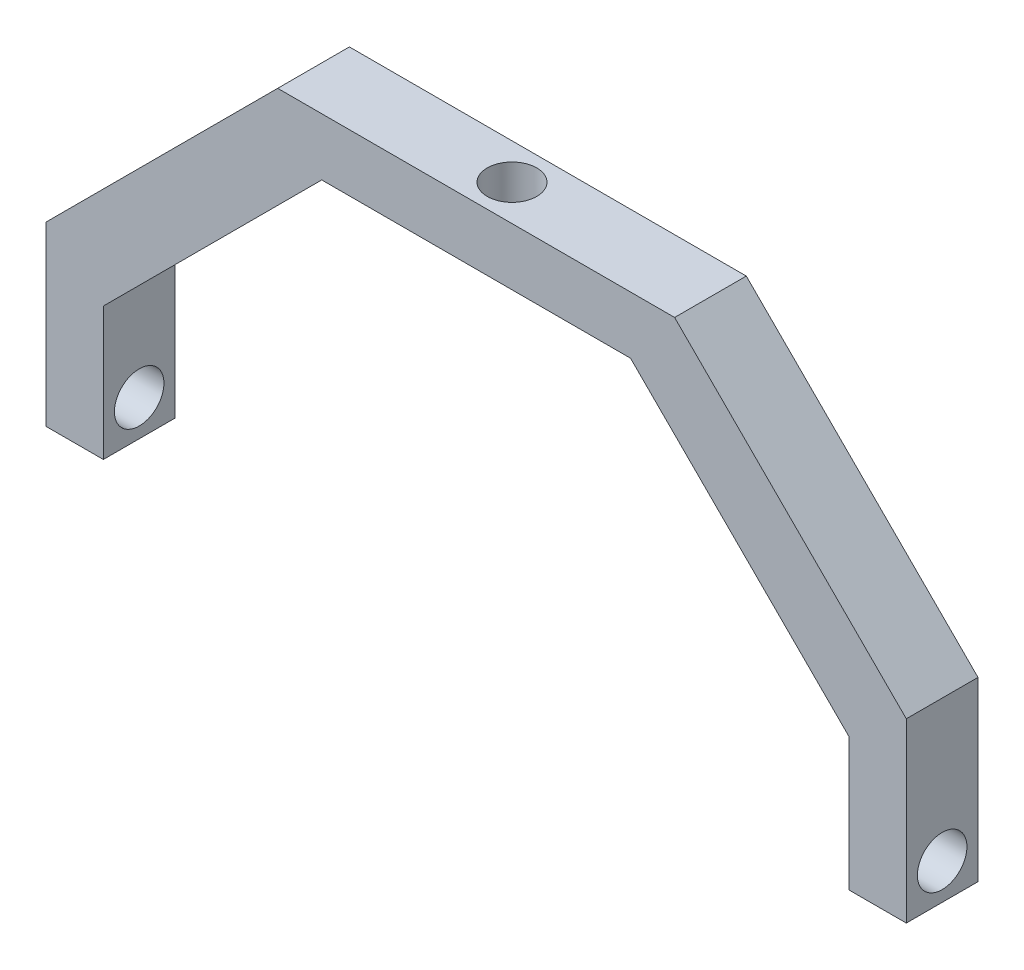
ISO-10303-21;
HEADER;
FILE_DESCRIPTION(('STEP AP214'),'2;1');
FILE_NAME('part.step','',(''),(''),'','','');
FILE_SCHEMA(('AUTOMOTIVE_DESIGN { 1 0 10303 214 1 1 1 1 }'));
ENDSEC;
DATA;
#1=APPLICATION_CONTEXT('core data for automotive mechanical design processes');
#2=APPLICATION_PROTOCOL_DEFINITION('international standard','automotive_design',2000,#1);
#3=PRODUCT_CONTEXT('',#1,'mechanical');
#4=PRODUCT('Part','Part','',(#3));
#5=PRODUCT_RELATED_PRODUCT_CATEGORY('part','',(#4));
#6=PRODUCT_DEFINITION_FORMATION('','',#4);
#7=PRODUCT_DEFINITION_CONTEXT('part definition',#1,'design');
#8=PRODUCT_DEFINITION('design','',#6,#7);
#9=PRODUCT_DEFINITION_SHAPE('','',#8);
#10=(LENGTH_UNIT() NAMED_UNIT(*) SI_UNIT(.MILLI.,.METRE.));
#11=(NAMED_UNIT(*) PLANE_ANGLE_UNIT() SI_UNIT($,.RADIAN.));
#12=(NAMED_UNIT(*) SI_UNIT($,.STERADIAN.) SOLID_ANGLE_UNIT());
#13=UNCERTAINTY_MEASURE_WITH_UNIT(LENGTH_MEASURE(1.E-05),#10,'distance_accuracy_value','');
#14=(GEOMETRIC_REPRESENTATION_CONTEXT(3) GLOBAL_UNCERTAINTY_ASSIGNED_CONTEXT((#13)) GLOBAL_UNIT_ASSIGNED_CONTEXT((#10,
#11,#12)) REPRESENTATION_CONTEXT('',''));
#15=CARTESIAN_POINT('',(0.,0.,0.));
#16=DIRECTION('',(0.,0.,1.));
#17=DIRECTION('',(1.,0.,0.));
#18=AXIS2_PLACEMENT_3D('',#15,#16,#17);
#19=CARTESIAN_POINT('',(-29.9999999999995,9.8406204335654,5.));
#20=DIRECTION('',(1.,0.,0.));
#21=DIRECTION('',(0.,1.,0.));
#22=AXIS2_PLACEMENT_3D('',#19,#20,#21);
#23=PLANE('',#22);
#24=DIRECTION('',(0.,-1.,0.));
#25=VECTOR('',#24,1.);
#26=CARTESIAN_POINT('',(-29.9999999999995,9.8406204335654,0.));
#27=LINE('',#26,#25);
#28=CARTESIAN_POINT('',(-29.9999999999995,9.8406204335654,0.));
#29=VERTEX_POINT('',#28);
#30=CARTESIAN_POINT('',(-29.9999999999998,-2.50000000000001,0.));
#31=VERTEX_POINT('',#30);
#32=EDGE_CURVE('E166',#29,#31,#27,.T.);
#33=ORIENTED_EDGE('',*,*,#32,.T.);
#34=DIRECTION('',(0.,0.,-1.));
#35=VECTOR('',#34,1.);
#36=CARTESIAN_POINT('',(-29.9999999999998,-2.50000000000001,5.));
#37=LINE('',#36,#35);
#38=CARTESIAN_POINT('',(-29.9999999999998,-2.50000000000001,5.));
#39=VERTEX_POINT('',#38);
#40=EDGE_CURVE('E11',#39,#31,#37,.T.);
#41=ORIENTED_EDGE('',*,*,#40,.F.);
#42=DIRECTION('',(0.,-1.,0.));
#43=VECTOR('',#42,1.);
#44=CARTESIAN_POINT('',(-29.9999999999995,9.8406204335654,5.));
#45=LINE('',#44,#43);
#46=CARTESIAN_POINT('',(-29.9999999999995,9.8406204335654,5.));
#47=VERTEX_POINT('',#46);
#48=EDGE_CURVE('E201',#47,#39,#45,.T.);
#49=ORIENTED_EDGE('',*,*,#48,.F.);
#50=DIRECTION('',(0.,0.,-1.));
#51=VECTOR('',#50,1.);
#52=CARTESIAN_POINT('',(-29.9999999999995,9.8406204335654,5.));
#53=LINE('',#52,#51);
#54=EDGE_CURVE('E162',#47,#29,#53,.T.);
#55=ORIENTED_EDGE('',*,*,#54,.T.);
#56=EDGE_LOOP('',(#33,#41,#49,#55));
#57=FACE_BOUND('',#56,.T.);
#58=CARTESIAN_POINT('',(-30.0000000000003,7.31165546704189E-13,2.5));
#59=DIRECTION('',(-1.,0.,0.));
#60=DIRECTION('',(0.,0.,1.));
#61=AXIS2_PLACEMENT_3D('',#58,#59,#60);
#62=CIRCLE('',#61,1.72719999999999);
#63=CARTESIAN_POINT('',(-30.0000000000003,7.31165546704189E-13,4.22719999999999));
#64=VERTEX_POINT('',#63);
#65=EDGE_CURVE('E482',#64,#64,#62,.T.);
#66=ORIENTED_EDGE('',*,*,#65,.F.);
#67=EDGE_LOOP('',(#66));
#68=FACE_BOUND('',#67,.T.);
#69=ADVANCED_FACE('F41',(#57,#68),#23,.F.);
#70=CARTESIAN_POINT('',(-29.9999999999998,-2.50000000000001,5.));
#71=DIRECTION('',(0.,1.,0.));
#72=DIRECTION('',(-1.,0.,0.));
#73=AXIS2_PLACEMENT_3D('',#70,#71,#72);
#74=PLANE('',#73);
#75=DIRECTION('',(1.,0.,0.));
#76=VECTOR('',#75,1.);
#77=CARTESIAN_POINT('',(-29.9999999999998,-2.50000000000001,0.));
#78=LINE('',#77,#76);
#79=CARTESIAN_POINT('',(-25.9999999999998,-2.50000000000001,0.));
#80=VERTEX_POINT('',#79);
#81=EDGE_CURVE('E170',#31,#80,#78,.T.);
#82=ORIENTED_EDGE('',*,*,#81,.T.);
#83=DIRECTION('',(0.,0.,-1.));
#84=VECTOR('',#83,1.);
#85=CARTESIAN_POINT('',(-25.9999999999998,-2.50000000000001,5.));
#86=LINE('',#85,#84);
#87=CARTESIAN_POINT('',(-25.9999999999998,-2.50000000000001,5.));
#88=VERTEX_POINT('',#87);
#89=EDGE_CURVE('E50',#88,#80,#86,.T.);
#90=ORIENTED_EDGE('',*,*,#89,.F.);
#91=DIRECTION('',(1.,0.,0.));
#92=VECTOR('',#91,1.);
#93=CARTESIAN_POINT('',(-29.9999999999998,-2.50000000000001,5.));
#94=LINE('',#93,#92);
#95=EDGE_CURVE('E113',#39,#88,#94,.T.);
#96=ORIENTED_EDGE('',*,*,#95,.F.);
#97=ORIENTED_EDGE('',*,*,#40,.T.);
#98=EDGE_LOOP('',(#82,#90,#96,#97));
#99=FACE_BOUND('',#98,.T.);
#100=ADVANCED_FACE('F297',(#99),#74,.F.);
#101=CARTESIAN_POINT('',(-25.9999999999998,-2.50000000000001,5.));
#102=DIRECTION('',(-1.,0.,0.));
#103=DIRECTION('',(0.,0.,1.));
#104=AXIS2_PLACEMENT_3D('',#101,#102,#103);
#105=PLANE('',#104);
#106=CARTESIAN_POINT('',(-25.9999999999998,7.31165546704189E-13,2.5));
#107=DIRECTION('',(-1.,0.,0.));
#108=DIRECTION('',(0.,0.,1.));
#109=AXIS2_PLACEMENT_3D('',#106,#107,#108);
#110=CIRCLE('',#109,1.7272);
#111=CARTESIAN_POINT('',(-25.9999999999998,7.31165546704189E-13,4.2272));
#112=VERTEX_POINT('',#111);
#113=EDGE_CURVE('E478',#112,#112,#110,.T.);
#114=ORIENTED_EDGE('',*,*,#113,.T.);
#115=EDGE_LOOP('',(#114));
#116=FACE_BOUND('',#115,.T.);
#117=DIRECTION('',(0.,1.,0.));
#118=VECTOR('',#117,1.);
#119=CARTESIAN_POINT('',(-25.9999999999998,-2.50000000000001,0.));
#120=LINE('',#119,#118);
#121=CARTESIAN_POINT('',(-25.9999999999998,6.76955262170028,0.));
#122=VERTEX_POINT('',#121);
#123=EDGE_CURVE('E174',#80,#122,#120,.T.);
#124=ORIENTED_EDGE('',*,*,#123,.T.);
#125=DIRECTION('',(0.,0.,-1.));
#126=VECTOR('',#125,1.);
#127=CARTESIAN_POINT('',(-25.9999999999998,6.76955262170028,5.));
#128=LINE('',#127,#126);
#129=CARTESIAN_POINT('',(-25.9999999999998,6.76955262170028,5.));
#130=VERTEX_POINT('',#129);
#131=EDGE_CURVE('E228',#130,#122,#128,.T.);
#132=ORIENTED_EDGE('',*,*,#131,.F.);
#133=DIRECTION('',(0.,1.,0.));
#134=VECTOR('',#133,1.);
#135=CARTESIAN_POINT('',(-25.9999999999998,-2.50000000000001,5.));
#136=LINE('',#135,#134);
#137=EDGE_CURVE('E238',#88,#130,#136,.T.);
#138=ORIENTED_EDGE('',*,*,#137,.F.);
#139=ORIENTED_EDGE('',*,*,#89,.T.);
#140=EDGE_LOOP('',(#124,#132,#138,#139));
#141=FACE_BOUND('',#140,.T.);
#142=ADVANCED_FACE('F236',(#116,#141),#105,.F.);
#143=CARTESIAN_POINT('',(-25.9999999999998,6.76955262170028,5.));
#144=DIRECTION('',(-0.707106781186556,0.707106781186539,0.));
#145=DIRECTION('',(-0.707106781186539,-0.707106781186556,0.));
#146=AXIS2_PLACEMENT_3D('',#143,#144,#145);
#147=PLANE('',#146);
#148=DIRECTION('',(0.707106781186539,0.707106781186556,0.));
#149=VECTOR('',#148,1.);
#150=CARTESIAN_POINT('',(-25.9999999999998,6.76955262170028,0.));
#151=LINE('',#150,#149);
#152=CARTESIAN_POINT('',(-10.7695526217005,22.,0.));
#153=VERTEX_POINT('',#152);
#154=EDGE_CURVE('E177',#122,#153,#151,.T.);
#155=ORIENTED_EDGE('',*,*,#154,.T.);
#156=DIRECTION('',(0.,0.,-1.));
#157=VECTOR('',#156,1.);
#158=CARTESIAN_POINT('',(-10.7695526217005,22.,5.));
#159=LINE('',#158,#157);
#160=CARTESIAN_POINT('',(-10.7695526217005,22.,5.));
#161=VERTEX_POINT('',#160);
#162=EDGE_CURVE('E224',#161,#153,#159,.T.);
#163=ORIENTED_EDGE('',*,*,#162,.F.);
#164=DIRECTION('',(0.707106781186539,0.707106781186556,0.));
#165=VECTOR('',#164,1.);
#166=CARTESIAN_POINT('',(-25.9999999999998,6.76955262170028,5.));
#167=LINE('',#166,#165);
#168=EDGE_CURVE('E257',#130,#161,#167,.T.);
#169=ORIENTED_EDGE('',*,*,#168,.F.);
#170=ORIENTED_EDGE('',*,*,#131,.T.);
#171=EDGE_LOOP('',(#155,#163,#169,#170));
#172=FACE_BOUND('',#171,.T.);
#173=ADVANCED_FACE('F247',(#172),#147,.F.);
#174=CARTESIAN_POINT('',(-10.7695526217005,22.,5.));
#175=DIRECTION('',(0.,1.,0.));
#176=DIRECTION('',(-1.,0.,0.));
#177=AXIS2_PLACEMENT_3D('',#174,#175,#176);
#178=PLANE('',#177);
#179=CARTESIAN_POINT('',(6.26421106538894E-13,22.,2.5));
#180=DIRECTION('',(0.,1.,0.));
#181=DIRECTION('',(-1.,0.,0.));
#182=AXIS2_PLACEMENT_3D('',#179,#180,#181);
#183=CIRCLE('',#182,1.7272);
#184=CARTESIAN_POINT('',(-1.72719999999937,22.,2.5));
#185=VERTEX_POINT('',#184);
#186=EDGE_CURVE('E467',#185,#185,#183,.T.);
#187=ORIENTED_EDGE('',*,*,#186,.T.);
#188=EDGE_LOOP('',(#187));
#189=FACE_BOUND('',#188,.T.);
#190=DIRECTION('',(1.,0.,0.));
#191=VECTOR('',#190,1.);
#192=CARTESIAN_POINT('',(-10.7695526217005,22.,0.));
#193=LINE('',#192,#191);
#194=CARTESIAN_POINT('',(10.7695526217005,22.,0.));
#195=VERTEX_POINT('',#194);
#196=EDGE_CURVE('E180',#153,#195,#193,.T.);
#197=ORIENTED_EDGE('',*,*,#196,.T.);
#198=DIRECTION('',(0.,0.,-1.));
#199=VECTOR('',#198,1.);
#200=CARTESIAN_POINT('',(10.7695526217005,22.,5.));
#201=LINE('',#200,#199);
#202=CARTESIAN_POINT('',(10.7695526217005,22.,5.));
#203=VERTEX_POINT('',#202);
#204=EDGE_CURVE('E220',#203,#195,#201,.T.);
#205=ORIENTED_EDGE('',*,*,#204,.F.);
#206=DIRECTION('',(1.,0.,0.));
#207=VECTOR('',#206,1.);
#208=CARTESIAN_POINT('',(-10.7695526217005,22.,5.));
#209=LINE('',#208,#207);
#210=EDGE_CURVE('E253',#161,#203,#209,.T.);
#211=ORIENTED_EDGE('',*,*,#210,.F.);
#212=ORIENTED_EDGE('',*,*,#162,.T.);
#213=EDGE_LOOP('',(#197,#205,#211,#212));
#214=FACE_BOUND('',#213,.T.);
#215=ADVANCED_FACE('F251',(#189,#214),#178,.F.);
#216=CARTESIAN_POINT('',(10.7695526217005,22.,5.));
#217=DIRECTION('',(0.707106781186539,0.707106781186556,0.));
#218=DIRECTION('',(-0.707106781186556,0.707106781186539,0.));
#219=AXIS2_PLACEMENT_3D('',#216,#217,#218);
#220=PLANE('',#219);
#221=DIRECTION('',(0.707106781186556,-0.707106781186539,0.));
#222=VECTOR('',#221,1.);
#223=CARTESIAN_POINT('',(10.7695526217005,22.,0.));
#224=LINE('',#223,#222);
#225=CARTESIAN_POINT('',(26.0000000000002,6.76955262170067,0.));
#226=VERTEX_POINT('',#225);
#227=EDGE_CURVE('E183',#195,#226,#224,.T.);
#228=ORIENTED_EDGE('',*,*,#227,.T.);
#229=DIRECTION('',(0.,0.,-1.));
#230=VECTOR('',#229,1.);
#231=CARTESIAN_POINT('',(26.0000000000002,6.76955262170067,5.));
#232=LINE('',#231,#230);
#233=CARTESIAN_POINT('',(26.0000000000002,6.76955262170067,5.));
#234=VERTEX_POINT('',#233);
#235=EDGE_CURVE('E216',#234,#226,#232,.T.);
#236=ORIENTED_EDGE('',*,*,#235,.F.);
#237=DIRECTION('',(0.707106781186556,-0.707106781186539,0.));
#238=VECTOR('',#237,1.);
#239=CARTESIAN_POINT('',(10.7695526217005,22.,5.));
#240=LINE('',#239,#238);
#241=EDGE_CURVE('E256',#203,#234,#240,.T.);
#242=ORIENTED_EDGE('',*,*,#241,.F.);
#243=ORIENTED_EDGE('',*,*,#204,.T.);
#244=EDGE_LOOP('',(#228,#236,#242,#243));
#245=FACE_BOUND('',#244,.T.);
#246=ADVANCED_FACE('F311',(#245),#220,.F.);
#247=CARTESIAN_POINT('',(26.0000000000002,6.76955262170067,5.));
#248=DIRECTION('',(1.,0.,0.));
#249=DIRECTION('',(0.,1.,0.));
#250=AXIS2_PLACEMENT_3D('',#247,#248,#249);
#251=PLANE('',#250);
#252=CARTESIAN_POINT('',(26.0000000000002,-7.31165546704189E-13,2.5));
#253=DIRECTION('',(1.,0.,0.));
#254=DIRECTION('',(0.,1.,0.));
#255=AXIS2_PLACEMENT_3D('',#252,#253,#254);
#256=CIRCLE('',#255,1.7272);
#257=CARTESIAN_POINT('',(26.0000000000002,1.72719999999926,2.5));
#258=VERTEX_POINT('',#257);
#259=EDGE_CURVE('E171',#258,#258,#256,.T.);
#260=ORIENTED_EDGE('',*,*,#259,.T.);
#261=EDGE_LOOP('',(#260));
#262=FACE_BOUND('',#261,.T.);
#263=DIRECTION('',(0.,-1.,0.));
#264=VECTOR('',#263,1.);
#265=CARTESIAN_POINT('',(26.0000000000002,6.76955262170067,0.));
#266=LINE('',#265,#264);
#267=CARTESIAN_POINT('',(26.0000000000002,-2.50000000000001,0.));
#268=VERTEX_POINT('',#267);
#269=EDGE_CURVE('E186',#226,#268,#266,.T.);
#270=ORIENTED_EDGE('',*,*,#269,.T.);
#271=DIRECTION('',(0.,0.,-1.));
#272=VECTOR('',#271,1.);
#273=CARTESIAN_POINT('',(26.0000000000002,-2.50000000000001,5.));
#274=LINE('',#273,#272);
#275=CARTESIAN_POINT('',(26.0000000000002,-2.50000000000001,5.));
#276=VERTEX_POINT('',#275);
#277=EDGE_CURVE('E212',#276,#268,#274,.T.);
#278=ORIENTED_EDGE('',*,*,#277,.F.);
#279=DIRECTION('',(0.,-1.,0.));
#280=VECTOR('',#279,1.);
#281=CARTESIAN_POINT('',(26.0000000000002,6.76955262170067,5.));
#282=LINE('',#281,#280);
#283=EDGE_CURVE('E261',#234,#276,#282,.T.);
#284=ORIENTED_EDGE('',*,*,#283,.F.);
#285=ORIENTED_EDGE('',*,*,#235,.T.);
#286=EDGE_LOOP('',(#270,#278,#284,#285));
#287=FACE_BOUND('',#286,.T.);
#288=ADVANCED_FACE('F315',(#262,#287),#251,.F.);
#289=CARTESIAN_POINT('',(26.0000000000002,-2.50000000000001,5.));
#290=DIRECTION('',(0.,1.,0.));
#291=DIRECTION('',(0.,0.,1.));
#292=AXIS2_PLACEMENT_3D('',#289,#290,#291);
#293=PLANE('',#292);
#294=DIRECTION('',(1.,0.,0.));
#295=VECTOR('',#294,1.);
#296=CARTESIAN_POINT('',(26.0000000000002,-2.50000000000001,0.));
#297=LINE('',#296,#295);
#298=CARTESIAN_POINT('',(30.0000000000002,-2.50000000000001,0.));
#299=VERTEX_POINT('',#298);
#300=EDGE_CURVE('E189',#268,#299,#297,.T.);
#301=ORIENTED_EDGE('',*,*,#300,.T.);
#302=DIRECTION('',(0.,0.,-1.));
#303=VECTOR('',#302,1.);
#304=CARTESIAN_POINT('',(30.0000000000002,-2.50000000000001,5.));
#305=LINE('',#304,#303);
#306=CARTESIAN_POINT('',(30.0000000000002,-2.50000000000001,5.));
#307=VERTEX_POINT('',#306);
#308=EDGE_CURVE('E208',#307,#299,#305,.T.);
#309=ORIENTED_EDGE('',*,*,#308,.F.);
#310=DIRECTION('',(1.,0.,0.));
#311=VECTOR('',#310,1.);
#312=CARTESIAN_POINT('',(26.0000000000002,-2.50000000000001,5.));
#313=LINE('',#312,#311);
#314=EDGE_CURVE('E268',#276,#307,#313,.T.);
#315=ORIENTED_EDGE('',*,*,#314,.F.);
#316=ORIENTED_EDGE('',*,*,#277,.T.);
#317=EDGE_LOOP('',(#301,#309,#315,#316));
#318=FACE_BOUND('',#317,.T.);
#319=ADVANCED_FACE('F276',(#318),#293,.F.);
#320=CARTESIAN_POINT('',(30.0000000000002,-2.50000000000001,5.));
#321=DIRECTION('',(-1.,0.,0.));
#322=DIRECTION('',(0.,-1.,0.));
#323=AXIS2_PLACEMENT_3D('',#320,#321,#322);
#324=PLANE('',#323);
#325=CARTESIAN_POINT('',(30.0000000000003,-7.31165546704189E-13,2.5));
#326=DIRECTION('',(1.,0.,0.));
#327=DIRECTION('',(0.,0.,-1.));
#328=AXIS2_PLACEMENT_3D('',#325,#326,#327);
#329=CIRCLE('',#328,1.72719999999999);
#330=CARTESIAN_POINT('',(30.0000000000003,-7.31165546704189E-13,0.772800000000007));
#331=VERTEX_POINT('',#330);
#332=EDGE_CURVE('E459',#331,#331,#329,.T.);
#333=ORIENTED_EDGE('',*,*,#332,.F.);
#334=EDGE_LOOP('',(#333));
#335=FACE_BOUND('',#334,.T.);
#336=DIRECTION('',(0.,1.,0.));
#337=VECTOR('',#336,1.);
#338=CARTESIAN_POINT('',(30.0000000000002,-2.50000000000001,0.));
#339=LINE('',#338,#337);
#340=CARTESIAN_POINT('',(30.0000000000005,9.84062043356581,0.));
#341=VERTEX_POINT('',#340);
#342=EDGE_CURVE('E192',#299,#341,#339,.T.);
#343=ORIENTED_EDGE('',*,*,#342,.T.);
#344=DIRECTION('',(0.,0.,-1.));
#345=VECTOR('',#344,1.);
#346=CARTESIAN_POINT('',(30.0000000000005,9.84062043356581,5.));
#347=LINE('',#346,#345);
#348=CARTESIAN_POINT('',(30.0000000000005,9.84062043356581,5.));
#349=VERTEX_POINT('',#348);
#350=EDGE_CURVE('E155',#349,#341,#347,.T.);
#351=ORIENTED_EDGE('',*,*,#350,.F.);
#352=DIRECTION('',(0.,1.,0.));
#353=VECTOR('',#352,1.);
#354=CARTESIAN_POINT('',(30.0000000000002,-2.50000000000001,5.));
#355=LINE('',#354,#353);
#356=EDGE_CURVE('E144',#307,#349,#355,.T.);
#357=ORIENTED_EDGE('',*,*,#356,.F.);
#358=ORIENTED_EDGE('',*,*,#308,.T.);
#359=EDGE_LOOP('',(#343,#351,#357,#358));
#360=FACE_BOUND('',#359,.T.);
#361=ADVANCED_FACE('F280',(#335,#360),#324,.F.);
#362=CARTESIAN_POINT('',(30.0000000000005,9.84062043356581,5.));
#363=DIRECTION('',(-0.707106781186539,-0.707106781186556,0.));
#364=DIRECTION('',(0.707106781186556,-0.707106781186539,0.));
#365=AXIS2_PLACEMENT_3D('',#362,#363,#364);
#366=PLANE('',#365);
#367=DIRECTION('',(-0.707106781186556,0.707106781186539,0.));
#368=VECTOR('',#367,1.);
#369=CARTESIAN_POINT('',(30.0000000000005,9.84062043356581,0.));
#370=LINE('',#369,#368);
#371=CARTESIAN_POINT('',(13.8406204335659,26.,0.));
#372=VERTEX_POINT('',#371);
#373=EDGE_CURVE('E153',#341,#372,#370,.T.);
#374=ORIENTED_EDGE('',*,*,#373,.T.);
#375=DIRECTION('',(0.,0.,-1.));
#376=VECTOR('',#375,1.);
#377=CARTESIAN_POINT('',(13.8406204335659,26.,5.));
#378=LINE('',#377,#376);
#379=CARTESIAN_POINT('',(13.8406204335659,26.,5.));
#380=VERTEX_POINT('',#379);
#381=EDGE_CURVE('E150',#380,#372,#378,.T.);
#382=ORIENTED_EDGE('',*,*,#381,.F.);
#383=DIRECTION('',(-0.707106781186556,0.707106781186539,0.));
#384=VECTOR('',#383,1.);
#385=CARTESIAN_POINT('',(30.0000000000005,9.84062043356581,5.));
#386=LINE('',#385,#384);
#387=EDGE_CURVE('E138',#349,#380,#386,.T.);
#388=ORIENTED_EDGE('',*,*,#387,.F.);
#389=ORIENTED_EDGE('',*,*,#350,.T.);
#390=EDGE_LOOP('',(#374,#382,#388,#389));
#391=FACE_BOUND('',#390,.T.);
#392=ADVANCED_FACE('F151',(#391),#366,.F.);
#393=CARTESIAN_POINT('',(13.8406204335659,26.,5.));
#394=DIRECTION('',(0.,-1.,0.));
#395=DIRECTION('',(1.,0.,0.));
#396=AXIS2_PLACEMENT_3D('',#393,#394,#395);
#397=PLANE('',#396);
#398=CARTESIAN_POINT('',(6.26421106538894E-13,26.,2.5));
#399=DIRECTION('',(0.,-1.,0.));
#400=DIRECTION('',(1.,0.,0.));
#401=AXIS2_PLACEMENT_3D('',#398,#399,#400);
#402=CIRCLE('',#401,1.7272);
#403=CARTESIAN_POINT('',(1.72720000000062,26.,2.5));
#404=VERTEX_POINT('',#403);
#405=EDGE_CURVE('E461',#404,#404,#402,.T.);
#406=ORIENTED_EDGE('',*,*,#405,.T.);
#407=EDGE_LOOP('',(#406));
#408=FACE_BOUND('',#407,.T.);
#409=DIRECTION('',(-1.,0.,0.));
#410=VECTOR('',#409,1.);
#411=CARTESIAN_POINT('',(13.8406204335659,26.,0.));
#412=LINE('',#411,#410);
#413=CARTESIAN_POINT('',(-13.8406204335653,26.,0.));
#414=VERTEX_POINT('',#413);
#415=EDGE_CURVE('E99',#372,#414,#412,.T.);
#416=ORIENTED_EDGE('',*,*,#415,.T.);
#417=DIRECTION('',(0.,0.,-1.));
#418=VECTOR('',#417,1.);
#419=CARTESIAN_POINT('',(-13.8406204335653,26.,5.));
#420=LINE('',#419,#418);
#421=CARTESIAN_POINT('',(-13.8406204335653,26.,5.));
#422=VERTEX_POINT('',#421);
#423=EDGE_CURVE('E156',#422,#414,#420,.T.);
#424=ORIENTED_EDGE('',*,*,#423,.F.);
#425=DIRECTION('',(-1.,0.,0.));
#426=VECTOR('',#425,1.);
#427=CARTESIAN_POINT('',(13.8406204335659,26.,5.));
#428=LINE('',#427,#426);
#429=EDGE_CURVE('E142',#380,#422,#428,.T.);
#430=ORIENTED_EDGE('',*,*,#429,.F.);
#431=ORIENTED_EDGE('',*,*,#381,.T.);
#432=EDGE_LOOP('',(#416,#424,#430,#431));
#433=FACE_BOUND('',#432,.T.);
#434=ADVANCED_FACE('F158',(#408,#433),#397,.F.);
#435=CARTESIAN_POINT('',(-13.8406204335653,26.,5.));
#436=DIRECTION('',(0.707106781186557,-0.707106781186538,0.));
#437=DIRECTION('',(0.707106781186538,0.707106781186557,0.));
#438=AXIS2_PLACEMENT_3D('',#435,#436,#437);
#439=PLANE('',#438);
#440=DIRECTION('',(-0.707106781186538,-0.707106781186557,0.));
#441=VECTOR('',#440,1.);
#442=CARTESIAN_POINT('',(-13.8406204335653,26.,0.));
#443=LINE('',#442,#441);
#444=EDGE_CURVE('E105',#414,#29,#443,.T.);
#445=ORIENTED_EDGE('',*,*,#444,.T.);
#446=ORIENTED_EDGE('',*,*,#54,.F.);
#447=DIRECTION('',(-0.707106781186538,-0.707106781186557,0.));
#448=VECTOR('',#447,1.);
#449=CARTESIAN_POINT('',(-13.8406204335653,26.,5.));
#450=LINE('',#449,#448);
#451=EDGE_CURVE('E58',#422,#47,#450,.T.);
#452=ORIENTED_EDGE('',*,*,#451,.F.);
#453=ORIENTED_EDGE('',*,*,#423,.T.);
#454=EDGE_LOOP('',(#445,#446,#452,#453));
#455=FACE_BOUND('',#454,.T.);
#456=ADVANCED_FACE('F285',(#455),#439,.F.);
#457=CARTESIAN_POINT('',(0.,0.,5.));
#458=DIRECTION('',(0.,0.,1.));
#459=DIRECTION('',(1.,0.,0.));
#460=AXIS2_PLACEMENT_3D('',#457,#458,#459);
#461=PLANE('',#460);
#462=ORIENTED_EDGE('',*,*,#48,.T.);
#463=ORIENTED_EDGE('',*,*,#95,.T.);
#464=ORIENTED_EDGE('',*,*,#137,.T.);
#465=ORIENTED_EDGE('',*,*,#168,.T.);
#466=ORIENTED_EDGE('',*,*,#210,.T.);
#467=ORIENTED_EDGE('',*,*,#241,.T.);
#468=ORIENTED_EDGE('',*,*,#283,.T.);
#469=ORIENTED_EDGE('',*,*,#314,.T.);
#470=ORIENTED_EDGE('',*,*,#356,.T.);
#471=ORIENTED_EDGE('',*,*,#387,.T.);
#472=ORIENTED_EDGE('',*,*,#429,.T.);
#473=ORIENTED_EDGE('',*,*,#451,.T.);
#474=EDGE_LOOP('',(#462,#463,#464,#465,#466,#467,#468,#469,#470,#471,#472,#473));
#475=FACE_BOUND('',#474,.T.);
#476=ADVANCED_FACE('F140',(#475),#461,.T.);
#477=CARTESIAN_POINT('',(0.,0.,0.));
#478=DIRECTION('',(0.,0.,1.));
#479=DIRECTION('',(1.,0.,0.));
#480=AXIS2_PLACEMENT_3D('',#477,#478,#479);
#481=PLANE('',#480);
#482=ORIENTED_EDGE('',*,*,#32,.F.);
#483=ORIENTED_EDGE('',*,*,#444,.F.);
#484=ORIENTED_EDGE('',*,*,#415,.F.);
#485=ORIENTED_EDGE('',*,*,#373,.F.);
#486=ORIENTED_EDGE('',*,*,#342,.F.);
#487=ORIENTED_EDGE('',*,*,#300,.F.);
#488=ORIENTED_EDGE('',*,*,#269,.F.);
#489=ORIENTED_EDGE('',*,*,#227,.F.);
#490=ORIENTED_EDGE('',*,*,#196,.F.);
#491=ORIENTED_EDGE('',*,*,#154,.F.);
#492=ORIENTED_EDGE('',*,*,#123,.F.);
#493=ORIENTED_EDGE('',*,*,#81,.F.);
#494=EDGE_LOOP('',(#482,#483,#484,#485,#486,#487,#488,#489,#490,#491,#492,#493));
#495=FACE_BOUND('',#494,.T.);
#496=ADVANCED_FACE('F242',(#495),#481,.F.);
#497=CARTESIAN_POINT('',(30.0000000000003,-7.31165546704189E-13,2.5));
#498=DIRECTION('',(1.,0.,0.));
#499=DIRECTION('',(0.,0.,-1.));
#500=AXIS2_PLACEMENT_3D('',#497,#498,#499);
#501=CYLINDRICAL_SURFACE('',#500,1.7272);
#502=ORIENTED_EDGE('',*,*,#259,.F.);
#503=EDGE_LOOP('',(#502));
#504=FACE_BOUND('',#503,.T.);
#505=ORIENTED_EDGE('',*,*,#332,.T.);
#506=EDGE_LOOP('',(#505));
#507=FACE_BOUND('',#506,.T.);
#508=ADVANCED_FACE('F352',(#504,#507),#501,.F.);
#509=CARTESIAN_POINT('',(6.26421106538894E-13,30.0000000000003,2.5));
#510=DIRECTION('',(0.,1.,0.));
#511=DIRECTION('',(0.,0.,1.));
#512=AXIS2_PLACEMENT_3D('',#509,#510,#511);
#513=CYLINDRICAL_SURFACE('',#512,1.7272);
#514=ORIENTED_EDGE('',*,*,#186,.F.);
#515=EDGE_LOOP('',(#514));
#516=FACE_BOUND('',#515,.T.);
#517=ORIENTED_EDGE('',*,*,#405,.F.);
#518=EDGE_LOOP('',(#517));
#519=FACE_BOUND('',#518,.T.);
#520=ADVANCED_FACE('F345',(#516,#519),#513,.F.);
#521=CARTESIAN_POINT('',(-30.0000000000003,7.31165546704189E-13,2.5));
#522=DIRECTION('',(-1.,0.,0.));
#523=DIRECTION('',(0.,0.,1.));
#524=AXIS2_PLACEMENT_3D('',#521,#522,#523);
#525=CYLINDRICAL_SURFACE('',#524,1.7272);
#526=ORIENTED_EDGE('',*,*,#113,.F.);
#527=EDGE_LOOP('',(#526));
#528=FACE_BOUND('',#527,.T.);
#529=ORIENTED_EDGE('',*,*,#65,.T.);
#530=EDGE_LOOP('',(#529));
#531=FACE_BOUND('',#530,.T.);
#532=ADVANCED_FACE('F351',(#528,#531),#525,.F.);
#533=CLOSED_SHELL('',(#69,#100,#142,#173,#215,#246,#288,#319,#361,#392,#434,#456,#476,#496,#508,
#520,#532));
#534=MANIFOLD_SOLID_BREP('B2',#533);
#535=ADVANCED_BREP_SHAPE_REPRESENTATION('',(#18,#534),#14);
#536=SHAPE_DEFINITION_REPRESENTATION(#9,#535);
ENDSEC;
END-ISO-10303-21;
